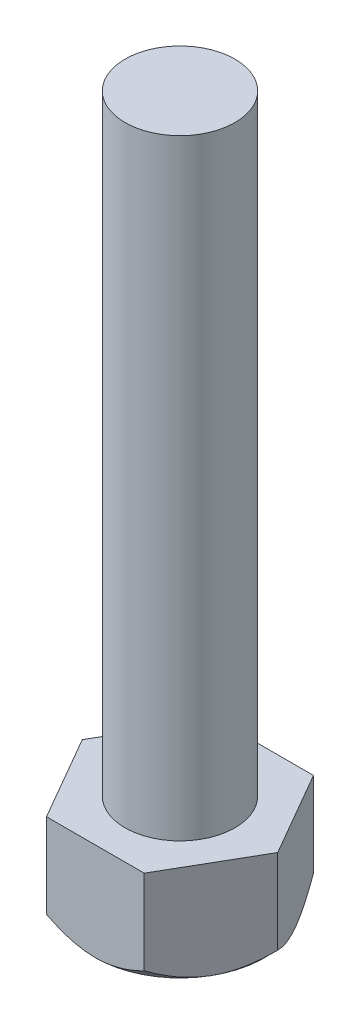
ISO-10303-21;
HEADER;
FILE_DESCRIPTION(('STEP AP214'),'2;1');
FILE_NAME('part.step','',(''),(''),'','','');
FILE_SCHEMA(('AUTOMOTIVE_DESIGN { 1 0 10303 214 1 1 1 1 }'));
ENDSEC;
DATA;
#1=APPLICATION_CONTEXT('core data for automotive mechanical design processes');
#2=APPLICATION_PROTOCOL_DEFINITION('international standard','automotive_design',2000,#1);
#3=PRODUCT_CONTEXT('',#1,'mechanical');
#4=PRODUCT('Part','Part','',(#3));
#5=PRODUCT_RELATED_PRODUCT_CATEGORY('part','',(#4));
#6=PRODUCT_DEFINITION_FORMATION('','',#4);
#7=PRODUCT_DEFINITION_CONTEXT('part definition',#1,'design');
#8=PRODUCT_DEFINITION('design','',#6,#7);
#9=PRODUCT_DEFINITION_SHAPE('','',#8);
#10=(LENGTH_UNIT() NAMED_UNIT(*) SI_UNIT(.MILLI.,.METRE.));
#11=(NAMED_UNIT(*) PLANE_ANGLE_UNIT() SI_UNIT($,.RADIAN.));
#12=(NAMED_UNIT(*) SI_UNIT($,.STERADIAN.) SOLID_ANGLE_UNIT());
#13=UNCERTAINTY_MEASURE_WITH_UNIT(LENGTH_MEASURE(1.E-05),#10,'distance_accuracy_value','');
#14=(GEOMETRIC_REPRESENTATION_CONTEXT(3) GLOBAL_UNCERTAINTY_ASSIGNED_CONTEXT((#13)) GLOBAL_UNIT_ASSIGNED_CONTEXT((#10,
#11,#12)) REPRESENTATION_CONTEXT('',''));
#15=CARTESIAN_POINT('',(0.,0.,0.));
#16=DIRECTION('',(0.,0.,1.));
#17=DIRECTION('',(1.,0.,0.));
#18=AXIS2_PLACEMENT_3D('',#15,#16,#17);
#19=CARTESIAN_POINT('',(-4.,4.,0.));
#20=DIRECTION('',(0.866025403784438,0.,-0.500000000000001));
#21=DIRECTION('',(-0.500000000000001,0.,-0.866025403784438));
#22=AXIS2_PLACEMENT_3D('',#19,#20,#21);
#23=PLANE('',#22);
#24=CARTESIAN_POINT('',(-1.99988452994616,0.536013859915936,3.46430161513775));
#25=CARTESIAN_POINT('',(-2.06863246295731,0.467325995781164,3.34522670224709));
#26=CARTESIAN_POINT('',(-2.13852994001664,0.40267241309835,3.22416072065947));
#27=CARTESIAN_POINT('',(-2.28105847687455,0.284293493314549,2.97729405329311));
#28=CARTESIAN_POINT('',(-2.35370308985488,0.230634017494356,2.851469892715));
#29=CARTESIAN_POINT('',(-2.50018745024056,0.138714421148478,2.59775153801277));
#30=CARTESIAN_POINT('',(-2.57398989649517,0.100223277486006,2.46992195137692));
#31=CARTESIAN_POINT('',(-2.72321949203156,0.0409198553913848,2.21144870991494));
#32=CARTESIAN_POINT('',(-2.79864208312694,0.020063312167609,2.08081295009925));
#33=CARTESIAN_POINT('',(-2.92863047900332,0.00124511322360298,1.85566644404699));
#34=CARTESIAN_POINT('',(-2.98302842594063,-0.001540448345799,1.76144643612413));
#35=CARTESIAN_POINT('',(-3.09173582960688,0.00315386675905833,1.57315968981528));
#36=CARTESIAN_POINT('',(-3.14604524863371,0.0106373420952294,1.47909301673127));
#37=CARTESIAN_POINT('',(-3.25414955803445,0.0354424365015808,1.29185086033204));
#38=CARTESIAN_POINT('',(-3.30794380435859,0.0527750595319466,1.19867649254375));
#39=CARTESIAN_POINT('',(-3.41460839868816,0.0963324102583245,1.01392799579621));
#40=CARTESIAN_POINT('',(-3.46747881720154,0.12255645620271,0.92235374471361));
#41=CARTESIAN_POINT('',(-3.56133806063717,0.176510647689823,0.759784766323124));
#42=CARTESIAN_POINT('',(-3.60253465928436,0.202822391913825,0.688430164367165));
#43=CARTESIAN_POINT('',(-3.68418827514934,0.259686362438078,0.547001953067301));
#44=CARTESIAN_POINT('',(-3.72464526979475,0.290238717916199,0.476928382819915));
#45=CARTESIAN_POINT('',(-3.80469221784007,0.354898965620273,0.338283001814589));
#46=CARTESIAN_POINT('',(-3.84428444795005,0.388995677398264,0.269707247679152));
#47=CARTESIAN_POINT('',(-3.92273567790658,0.460296863693675,0.133825731478174));
#48=CARTESIAN_POINT('',(-3.96159510997834,0.497499431227526,0.0665192207766153));
#49=CARTESIAN_POINT('',(-4.00011547005384,0.536013859915937,-0.000199999999999689));
#50=B_SPLINE_CURVE_WITH_KNOTS('',3,(#24,#25,#26,#27,#28,#29,#30,#31,#32,#33,#34,#35,#36,#37,#38,
#39,#40,#41,#42,#43,#44,#45,#46,#47,#48,#49),.UNSPECIFIED.,.F.,.F.,(4,2,2,2,2,2,2,2,2,2,2,2,4),
(0.,0.46141397689546,0.925516105496516,1.38224785443131,1.83782972377834,2.16386281017194,
2.49001018016783,2.81652265677474,3.14301010363181,3.40236585633197,3.66172951128433,
3.92029851377053,4.17870990731808),.UNSPECIFIED.);
#51=CARTESIAN_POINT('',(-2.,0.535898384862242,3.46410161513775));
#52=VERTEX_POINT('',#51);
#53=CARTESIAN_POINT('',(-3.,0.,1.73205080756888));
#54=VERTEX_POINT('',#53);
#55=EDGE_CURVE('E128',#52,#54,#50,.T.);
#56=ORIENTED_EDGE('',*,*,#55,.F.);
#57=DIRECTION('',(0.,-1.,0.));
#58=VECTOR('',#57,1.);
#59=CARTESIAN_POINT('',(-2.,4.,3.46410161513775));
#60=LINE('',#59,#58);
#61=CARTESIAN_POINT('',(-2.,4.,3.46410161513775));
#62=VERTEX_POINT('',#61);
#63=EDGE_CURVE('E132',#62,#52,#60,.T.);
#64=ORIENTED_EDGE('',*,*,#63,.F.);
#65=DIRECTION('',(0.500000000000001,0.,0.866025403784438));
#66=VECTOR('',#65,1.);
#67=CARTESIAN_POINT('',(-4.,4.,0.));
#68=LINE('',#67,#66);
#69=CARTESIAN_POINT('',(-4.,4.,0.));
#70=VERTEX_POINT('',#69);
#71=EDGE_CURVE('E233',#70,#62,#68,.T.);
#72=ORIENTED_EDGE('',*,*,#71,.F.);
#73=DIRECTION('',(0.,-1.,0.));
#74=VECTOR('',#73,1.);
#75=CARTESIAN_POINT('',(-4.,4.,0.));
#76=LINE('',#75,#74);
#77=CARTESIAN_POINT('',(-4.,0.535898384862244,0.));
#78=VERTEX_POINT('',#77);
#79=EDGE_CURVE('E221',#70,#78,#76,.T.);
#80=ORIENTED_EDGE('',*,*,#79,.T.);
#81=EDGE_CURVE('E187',#54,#78,#50,.T.);
#82=ORIENTED_EDGE('',*,*,#81,.F.);
#83=EDGE_LOOP('',(#56,#64,#72,#80,#82));
#84=FACE_BOUND('',#83,.T.);
#85=ADVANCED_FACE('F38',(#84),#23,.F.);
#86=CARTESIAN_POINT('',(-2.,4.,3.46410161513775));
#87=DIRECTION('',(0.,0.,-1.));
#88=DIRECTION('',(-1.,0.,0.));
#89=AXIS2_PLACEMENT_3D('',#86,#87,#88);
#90=PLANE('',#89);
#91=CARTESIAN_POINT('',(6.12330562561766,3.57115756876732,3.46410161513775));
#92=CARTESIAN_POINT('',(5.9426617997815,3.41399020044523,3.46410161513775));
#93=CARTESIAN_POINT('',(5.76123137966631,3.25770955980369,3.46410161513775));
#94=CARTESIAN_POINT('',(5.39618419077211,2.94755293704087,3.46410161513775));
#95=CARTESIAN_POINT('',(5.21256644609498,2.7936781049514,3.46410161513775));
#96=CARTESIAN_POINT('',(4.83863699097268,2.4857673575733,3.46410161513775));
#97=CARTESIAN_POINT('',(4.64826682950476,2.3318021114302,3.46410161513775));
#98=CARTESIAN_POINT('',(4.26400226748118,2.02841972308538,3.46410161513775));
#99=CARTESIAN_POINT('',(4.07010875527937,1.87900145916858,3.46410161513775));
#100=CARTESIAN_POINT('',(3.6773735453801,1.58622986260935,3.46410161513775));
#101=CARTESIAN_POINT('',(3.47852607140583,1.4428841919399,3.46410161513775));
#102=CARTESIAN_POINT('',(3.17545854797373,1.23464207559921,3.46410161513775));
#103=CARTESIAN_POINT('',(3.07358834182002,1.16632735547672,3.46410161513775));
#104=CARTESIAN_POINT('',(2.86802327233887,1.03250335605779,3.46410161513775));
#105=CARTESIAN_POINT('',(2.76432852870836,0.966993893686298,3.46410161513775));
#106=CARTESIAN_POINT('',(2.55557212591568,0.83986684875357,3.46410161513775));
#107=CARTESIAN_POINT('',(2.45052526036266,0.778225081311306,3.46410161513775));
#108=CARTESIAN_POINT('',(2.23804782632973,0.659139068336162,3.46410161513775));
#109=CARTESIAN_POINT('',(2.1306169720612,0.601695329638526,3.46410161513775));
#110=CARTESIAN_POINT('',(1.9132583375044,0.492129082614428,3.46410161513775));
#111=CARTESIAN_POINT('',(1.80333457855957,0.439998659202886,3.46410161513775));
#112=CARTESIAN_POINT('',(1.58063205734083,0.342260495490114,3.46410161513775));
#113=CARTESIAN_POINT('',(1.46785407585032,0.296650993588385,3.46410161513775));
#114=CARTESIAN_POINT('',(1.23675001483471,0.212543030042841,3.46410161513775));
#115=CARTESIAN_POINT('',(1.11835617123291,0.174228161645824,3.46410161513775));
#116=CARTESIAN_POINT('',(0.878699038057535,0.107854975582135,3.46410161513775));
#117=CARTESIAN_POINT('',(0.757436207828092,0.0797950277080224,3.46410161513775));
#118=CARTESIAN_POINT('',(0.513513895977743,0.0358155721553112,3.46410161513775));
#119=CARTESIAN_POINT('',(0.39086897356948,0.0198169279633217,3.46410161513775));
#120=CARTESIAN_POINT('',(0.144568282916073,0.000842558181825476,3.46410161513775));
#121=CARTESIAN_POINT('',(0.0209126443799982,-0.00213481298236062,3.46410161513775));
#122=CARTESIAN_POINT('',(-0.226270833074271,0.00517763883403837,3.46410161513775));
#123=CARTESIAN_POINT('',(-0.349797783224328,0.0154968437834157,3.46410161513775));
#124=CARTESIAN_POINT('',(-0.595149165300502,0.0486475093076494,3.46410161513775));
#125=CARTESIAN_POINT('',(-0.71697324001165,0.0714815559158489,3.46410161513775));
#126=CARTESIAN_POINT('',(-0.958890866974615,0.12832471634713,3.46410161513775));
#127=CARTESIAN_POINT('',(-1.0789648999152,0.162415405130286,3.46410161513775));
#128=CARTESIAN_POINT('',(-1.31603785676646,0.239868265131488,3.46410161513775));
#129=CARTESIAN_POINT('',(-1.4330367001755,0.283230678791782,3.46410161513775));
#130=CARTESIAN_POINT('',(-1.6872922274193,0.386986466744351,3.46410161513775));
#131=CARTESIAN_POINT('',(-1.82386091893597,0.449050623806043,3.46410161513775));
#132=CARTESIAN_POINT('',(-2.09294885830601,0.58147712649516,3.46410161513775));
#133=CARTESIAN_POINT('',(-2.22546574729758,0.651844194265927,3.46410161513775));
#134=CARTESIAN_POINT('',(-2.48718748012284,0.799039662294178,3.46410161513775));
#135=CARTESIAN_POINT('',(-2.61638501421286,0.875880953537441,3.46410161513776));
#136=CARTESIAN_POINT('',(-2.8717086097767,1.03442087198194,3.46410161513776));
#137=CARTESIAN_POINT('',(-2.99783526490351,1.11611854968165,3.46410161513776));
#138=CARTESIAN_POINT('',(-3.24821348879723,1.28376080862406,3.46410161513776));
#139=CARTESIAN_POINT('',(-3.37245118590576,1.36972601177335,3.46410161513776));
#140=CARTESIAN_POINT('',(-3.61877413372762,1.54469395871281,3.46410161513776));
#141=CARTESIAN_POINT('',(-3.74085922087204,1.63369693183625,3.46410161513776));
#142=CARTESIAN_POINT('',(-4.10412985090608,1.90410163377095,3.46410161513776));
#143=CARTESIAN_POINT('',(-4.34263110550769,2.08910469121418,3.46410161513776));
#144=CARTESIAN_POINT('',(-4.8427234808062,2.48792865822459,3.46410161513776));
#145=CARTESIAN_POINT('',(-5.10366879659832,2.70255178060159,3.46410161513776));
#146=CARTESIAN_POINT('',(-5.49019500293962,3.02723800850587,3.46410161513776));
#147=CARTESIAN_POINT('',(-5.61748460190559,3.13527973152068,3.46410161513776));
#148=CARTESIAN_POINT('',(-5.87108384173981,3.35244804868488,3.46410161513776));
#149=CARTESIAN_POINT('',(-5.99739370485389,3.46157438317508,3.46410161513776));
#150=CARTESIAN_POINT('',(-6.12330562561766,3.57115756876732,3.46410161513776));
#151=B_SPLINE_CURVE_WITH_KNOTS('',3,(#91,#92,#93,#94,#95,#96,#97,#98,#99,#100,#101,#102,#103,
#104,#105,#106,#107,#108,#109,#110,#111,#112,#113,#114,#115,#116,#117,#118,#119,#120,#121,#122,
#123,#124,#125,#126,#127,#128,#129,#130,#131,#132,#133,#134,#135,#136,#137,#138,#139,#140,#141,
#142,#143,#144,#145,#146,#147,#148,#149,#150),.UNSPECIFIED.,.F.,.F.,(4,2,2,2,2,2,2,2,2,2,2,2,2,
2,2,2,2,2,2,2,2,2,2,2,2,2,2,2,2,4),(0.,0.718348010521054,1.43702951022251,2.17149343947353,
2.90577468707162,3.64095636673365,4.00888831418214,4.37679621316671,4.74210997566971,
5.10746777051841,5.47227309402859,5.83697967989172,6.20991225867724,6.58278552718511,
6.95319048523883,7.32354863169162,7.69472657835838,8.06598125317446,8.43998766122979,
8.81400385021009,9.26365507843157,9.71356328230224,10.1643894961722,10.6151278543581,
11.0683097070005,11.5215258481395,12.4268672114345,13.4403751424198,13.9412505421146,
14.4420087883924),.UNSPECIFIED.);
#152=CARTESIAN_POINT('',(2.,0.535898384862243,3.46410161513775));
#153=VERTEX_POINT('',#152);
#154=CARTESIAN_POINT('',(0.,0.,3.46410161513775));
#155=VERTEX_POINT('',#154);
#156=EDGE_CURVE('E109',#153,#155,#151,.T.);
#157=ORIENTED_EDGE('',*,*,#156,.F.);
#158=DIRECTION('',(0.,-1.,0.));
#159=VECTOR('',#158,1.);
#160=CARTESIAN_POINT('',(2.,4.,3.46410161513775));
#161=LINE('',#160,#159);
#162=CARTESIAN_POINT('',(2.,4.,3.46410161513775));
#163=VERTEX_POINT('',#162);
#164=EDGE_CURVE('E218',#163,#153,#161,.T.);
#165=ORIENTED_EDGE('',*,*,#164,.F.);
#166=DIRECTION('',(1.,0.,0.));
#167=VECTOR('',#166,1.);
#168=CARTESIAN_POINT('',(-2.,4.,3.46410161513775));
#169=LINE('',#168,#167);
#170=EDGE_CURVE('E230',#62,#163,#169,.T.);
#171=ORIENTED_EDGE('',*,*,#170,.F.);
#172=ORIENTED_EDGE('',*,*,#63,.T.);
#173=EDGE_CURVE('E121',#155,#52,#151,.T.);
#174=ORIENTED_EDGE('',*,*,#173,.F.);
#175=EDGE_LOOP('',(#157,#165,#171,#172,#174));
#176=FACE_BOUND('',#175,.T.);
#177=ADVANCED_FACE('F136',(#176),#90,.F.);
#178=CARTESIAN_POINT('',(2.,4.,3.46410161513775));
#179=DIRECTION('',(-0.866025403784439,0.,-0.5));
#180=DIRECTION('',(-0.5,0.,0.866025403784439));
#181=AXIS2_PLACEMENT_3D('',#178,#179,#180);
#182=PLANE('',#181);
#183=CARTESIAN_POINT('',(4.00011547005384,0.536013859915938,-0.000199999999999576));
#184=CARTESIAN_POINT('',(3.93136753704268,0.467325995781166,0.118874912890663));
#185=CARTESIAN_POINT('',(3.86147005998336,0.402672413098352,0.239940894478286));
#186=CARTESIAN_POINT('',(3.71894152312545,0.28429349331455,0.486807561844643));
#187=CARTESIAN_POINT('',(3.64629691014512,0.230634017494358,0.612631722422753));
#188=CARTESIAN_POINT('',(3.49981254975944,0.138714421148479,0.866350077124988));
#189=CARTESIAN_POINT('',(3.42601010350483,0.100223277486008,0.994179663760835));
#190=CARTESIAN_POINT('',(3.27678050796844,0.0409198553913868,1.25265290522282));
#191=CARTESIAN_POINT('',(3.20135791687306,0.0200633121676109,1.38328866503851));
#192=CARTESIAN_POINT('',(3.07136952099668,0.00124511322360464,1.60843517109077));
#193=CARTESIAN_POINT('',(3.01697157405937,-0.00154044834579735,1.70265517901363));
#194=CARTESIAN_POINT('',(2.90826417039312,0.00315386675905971,1.89094192532248));
#195=CARTESIAN_POINT('',(2.85395475136629,0.0106373420952305,1.98500859840649));
#196=CARTESIAN_POINT('',(2.74585044196555,0.0354424365015819,2.17225075480572));
#197=CARTESIAN_POINT('',(2.69205619564141,0.052775059531948,2.26542512259401));
#198=CARTESIAN_POINT('',(2.58539160131184,0.096332410258326,2.45017361934154));
#199=CARTESIAN_POINT('',(2.53252118279846,0.122556456202712,2.54174787042415));
#200=CARTESIAN_POINT('',(2.43866193936283,0.176510647689824,2.70431684881463));
#201=CARTESIAN_POINT('',(2.39746534071564,0.202822391913826,2.77567145077059));
#202=CARTESIAN_POINT('',(2.31581172485066,0.259686362438079,2.91709966207045));
#203=CARTESIAN_POINT('',(2.27535473020525,0.290238717916199,2.98717323231784));
#204=CARTESIAN_POINT('',(2.19530778215993,0.354898965620273,3.12581861332316));
#205=CARTESIAN_POINT('',(2.15571555204995,0.388995677398264,3.1943943674586));
#206=CARTESIAN_POINT('',(2.07726432209342,0.460296863693675,3.33027588365958));
#207=CARTESIAN_POINT('',(2.03840489002166,0.497499431227526,3.39758239436114));
#208=CARTESIAN_POINT('',(1.99988452994616,0.536013859915936,3.46430161513775));
#209=B_SPLINE_CURVE_WITH_KNOTS('',3,(#183,#184,#185,#186,#187,#188,#189,#190,#191,#192,#193,
#194,#195,#196,#197,#198,#199,#200,#201,#202,#203,#204,#205,#206,#207,#208),.UNSPECIFIED.,.F.,
.F.,(4,2,2,2,2,2,2,2,2,2,2,2,4),(0.,0.46141397689546,0.925516105496516,1.38224785443131,
1.83782972377834,2.16386281017194,2.49001018016783,2.81652265677474,3.14301010363181,
3.40236585633197,3.66172951128433,3.92029851377053,4.17870990731807),.UNSPECIFIED.);
#210=CARTESIAN_POINT('',(4.,0.535898384862244,0.));
#211=VERTEX_POINT('',#210);
#212=CARTESIAN_POINT('',(3.,0.,1.73205080756888));
#213=VERTEX_POINT('',#212);
#214=EDGE_CURVE('E54',#211,#213,#209,.T.);
#215=ORIENTED_EDGE('',*,*,#214,.F.);
#216=DIRECTION('',(0.,-1.,0.));
#217=VECTOR('',#216,1.);
#218=CARTESIAN_POINT('',(4.,4.,0.));
#219=LINE('',#218,#217);
#220=CARTESIAN_POINT('',(4.,4.,0.));
#221=VERTEX_POINT('',#220);
#222=EDGE_CURVE('E215',#221,#211,#219,.T.);
#223=ORIENTED_EDGE('',*,*,#222,.F.);
#224=DIRECTION('',(0.5,0.,-0.866025403784439));
#225=VECTOR('',#224,1.);
#226=CARTESIAN_POINT('',(2.,4.,3.46410161513775));
#227=LINE('',#226,#225);
#228=EDGE_CURVE('E229',#163,#221,#227,.T.);
#229=ORIENTED_EDGE('',*,*,#228,.F.);
#230=ORIENTED_EDGE('',*,*,#164,.T.);
#231=EDGE_CURVE('E115',#213,#153,#209,.T.);
#232=ORIENTED_EDGE('',*,*,#231,.F.);
#233=EDGE_LOOP('',(#215,#223,#229,#230,#232));
#234=FACE_BOUND('',#233,.T.);
#235=ADVANCED_FACE('F227',(#234),#182,.F.);
#236=CARTESIAN_POINT('',(4.,4.,0.));
#237=DIRECTION('',(-0.866025403784439,0.,0.5));
#238=DIRECTION('',(0.5,0.,0.866025403784438));
#239=AXIS2_PLACEMENT_3D('',#236,#237,#238);
#240=PLANE('',#239);
#241=CARTESIAN_POINT('',(1.99988452994616,0.536013859915936,-3.46430161513775));
#242=CARTESIAN_POINT('',(2.06863246295732,0.467325995781164,-3.34522670224709));
#243=CARTESIAN_POINT('',(2.13852994001664,0.40267241309835,-3.22416072065947));
#244=CARTESIAN_POINT('',(2.28105847687455,0.284293493314549,-2.97729405329311));
#245=CARTESIAN_POINT('',(2.35370308985488,0.230634017494357,-2.851469892715));
#246=CARTESIAN_POINT('',(2.50018745024056,0.138714421148478,-2.59775153801277));
#247=CARTESIAN_POINT('',(2.57398989649517,0.100223277486007,-2.46992195137692));
#248=CARTESIAN_POINT('',(2.72321949203156,0.0409198553913856,-2.21144870991494));
#249=CARTESIAN_POINT('',(2.79864208312694,0.0200633121676099,-2.08081295009925));
#250=CARTESIAN_POINT('',(2.92863047900332,0.00124511322360396,-1.85566644404699));
#251=CARTESIAN_POINT('',(2.98302842594063,-0.00154044834579799,-1.76144643612413));
#252=CARTESIAN_POINT('',(3.09173582960688,0.00315386675905906,-1.57315968981528));
#253=CARTESIAN_POINT('',(3.14604524863371,0.0106373420952298,-1.47909301673127));
#254=CARTESIAN_POINT('',(3.25414955803445,0.0354424365015808,-1.29185086033204));
#255=CARTESIAN_POINT('',(3.30794380435859,0.0527750595319466,-1.19867649254375));
#256=CARTESIAN_POINT('',(3.41460839868816,0.0963324102583245,-1.01392799579621));
#257=CARTESIAN_POINT('',(3.46747881720154,0.122556456202711,-0.92235374471361));
#258=CARTESIAN_POINT('',(3.56133806063717,0.176510647689823,-0.759784766323125));
#259=CARTESIAN_POINT('',(3.60253465928436,0.202822391913825,-0.688430164367165));
#260=CARTESIAN_POINT('',(3.68418827514934,0.259686362438078,-0.547001953067301));
#261=CARTESIAN_POINT('',(3.72464526979475,0.290238717916199,-0.476928382819915));
#262=CARTESIAN_POINT('',(3.80469221784007,0.354898965620273,-0.338283001814589));
#263=CARTESIAN_POINT('',(3.84428444795005,0.388995677398265,-0.269707247679152));
#264=CARTESIAN_POINT('',(3.92273567790658,0.460296863693675,-0.133825731478173));
#265=CARTESIAN_POINT('',(3.96159510997834,0.497499431227527,-0.0665192207766143));
#266=CARTESIAN_POINT('',(4.00011547005384,0.536013859915938,0.000200000000000841));
#267=B_SPLINE_CURVE_WITH_KNOTS('',3,(#241,#242,#243,#244,#245,#246,#247,#248,#249,#250,#251,
#252,#253,#254,#255,#256,#257,#258,#259,#260,#261,#262,#263,#264,#265,#266),.UNSPECIFIED.,.F.,
.F.,(4,2,2,2,2,2,2,2,2,2,2,2,4),(0.,0.46141397689546,0.925516105496515,1.38224785443131,
1.83782972377834,2.16386281017193,2.49001018016782,2.81652265677473,3.14301010363181,
3.40236585633197,3.66172951128433,3.92029851377053,4.17870990731808),.UNSPECIFIED.);
#268=CARTESIAN_POINT('',(2.,0.535898384862243,-3.46410161513775));
#269=VERTEX_POINT('',#268);
#270=CARTESIAN_POINT('',(3.,0.,-1.73205080756888));
#271=VERTEX_POINT('',#270);
#272=EDGE_CURVE('E61',#269,#271,#267,.T.);
#273=ORIENTED_EDGE('',*,*,#272,.F.);
#274=DIRECTION('',(0.,-1.,0.));
#275=VECTOR('',#274,1.);
#276=CARTESIAN_POINT('',(2.,4.,-3.46410161513775));
#277=LINE('',#276,#275);
#278=CARTESIAN_POINT('',(2.,4.,-3.46410161513775));
#279=VERTEX_POINT('',#278);
#280=EDGE_CURVE('E209',#279,#269,#277,.T.);
#281=ORIENTED_EDGE('',*,*,#280,.F.);
#282=DIRECTION('',(-0.5,0.,-0.866025403784438));
#283=VECTOR('',#282,1.);
#284=CARTESIAN_POINT('',(4.,4.,0.));
#285=LINE('',#284,#283);
#286=EDGE_CURVE('E248',#221,#279,#285,.T.);
#287=ORIENTED_EDGE('',*,*,#286,.F.);
#288=ORIENTED_EDGE('',*,*,#222,.T.);
#289=EDGE_CURVE('E120',#271,#211,#267,.T.);
#290=ORIENTED_EDGE('',*,*,#289,.F.);
#291=EDGE_LOOP('',(#273,#281,#287,#288,#290));
#292=FACE_BOUND('',#291,.T.);
#293=ADVANCED_FACE('F207',(#292),#240,.F.);
#294=CARTESIAN_POINT('',(2.,4.,-3.46410161513775));
#295=DIRECTION('',(0.,0.,1.));
#296=DIRECTION('',(1.,0.,0.));
#297=AXIS2_PLACEMENT_3D('',#294,#295,#296);
#298=PLANE('',#297);
#299=CARTESIAN_POINT('',(-6.12330562561766,3.57115756876732,-3.46410161513775));
#300=CARTESIAN_POINT('',(-5.9426617997815,3.41399020044523,-3.46410161513775));
#301=CARTESIAN_POINT('',(-5.76123137966631,3.25770955980369,-3.46410161513775));
#302=CARTESIAN_POINT('',(-5.39618419077211,2.94755293704087,-3.46410161513775));
#303=CARTESIAN_POINT('',(-5.21256644609498,2.7936781049514,-3.46410161513775));
#304=CARTESIAN_POINT('',(-4.83863699097268,2.4857673575733,-3.46410161513775));
#305=CARTESIAN_POINT('',(-4.64826682950476,2.3318021114302,-3.46410161513775));
#306=CARTESIAN_POINT('',(-4.26400226748118,2.02841972308538,-3.46410161513775));
#307=CARTESIAN_POINT('',(-4.07010875527937,1.87900145916858,-3.46410161513775));
#308=CARTESIAN_POINT('',(-3.6773735453801,1.58622986260935,-3.46410161513775));
#309=CARTESIAN_POINT('',(-3.47852607140582,1.4428841919399,-3.46410161513775));
#310=CARTESIAN_POINT('',(-3.17545854797373,1.23464207559921,-3.46410161513775));
#311=CARTESIAN_POINT('',(-3.07358834182002,1.16632735547672,-3.46410161513775));
#312=CARTESIAN_POINT('',(-2.86802327233887,1.0325033560578,-3.46410161513775));
#313=CARTESIAN_POINT('',(-2.76432852870836,0.966993893686298,-3.46410161513775));
#314=CARTESIAN_POINT('',(-2.55557212591568,0.83986684875357,-3.46410161513775));
#315=CARTESIAN_POINT('',(-2.45052526036266,0.778225081311307,-3.46410161513775));
#316=CARTESIAN_POINT('',(-2.23804782632972,0.659139068336163,-3.46410161513775));
#317=CARTESIAN_POINT('',(-2.1306169720612,0.601695329638526,-3.46410161513775));
#318=CARTESIAN_POINT('',(-1.9132583375044,0.492129082614428,-3.46410161513775));
#319=CARTESIAN_POINT('',(-1.80333457855956,0.439998659202886,-3.46410161513775));
#320=CARTESIAN_POINT('',(-1.58063205734083,0.342260495490115,-3.46410161513775));
#321=CARTESIAN_POINT('',(-1.46785407585032,0.296650993588385,-3.46410161513775));
#322=CARTESIAN_POINT('',(-1.23675001483471,0.212543030042841,-3.46410161513775));
#323=CARTESIAN_POINT('',(-1.11835617123291,0.174228161645824,-3.46410161513775));
#324=CARTESIAN_POINT('',(-0.878699038057533,0.107854975582134,-3.46410161513775));
#325=CARTESIAN_POINT('',(-0.757436207828089,0.0797950277080226,-3.46410161513775));
#326=CARTESIAN_POINT('',(-0.513513895977741,0.0358155721553116,-3.46410161513775));
#327=CARTESIAN_POINT('',(-0.390868973569478,0.0198169279633219,-3.46410161513775));
#328=CARTESIAN_POINT('',(-0.144568282916071,0.000842558181825484,-3.46410161513775));
#329=CARTESIAN_POINT('',(-0.0209126443799965,-0.0021348129823606,-3.46410161513775));
#330=CARTESIAN_POINT('',(0.226270833074273,0.00517763883403826,-3.46410161513775));
#331=CARTESIAN_POINT('',(0.34979778322433,0.0154968437834155,-3.46410161513775));
#332=CARTESIAN_POINT('',(0.595149165300505,0.0486475093076492,-3.46410161513775));
#333=CARTESIAN_POINT('',(0.716973240011652,0.0714815559158489,-3.46410161513775));
#334=CARTESIAN_POINT('',(0.958890866974617,0.128324716347131,-3.46410161513775));
#335=CARTESIAN_POINT('',(1.0789648999152,0.162415405130286,-3.46410161513775));
#336=CARTESIAN_POINT('',(1.31603785676646,0.239868265131488,-3.46410161513775));
#337=CARTESIAN_POINT('',(1.43303670017551,0.283230678791782,-3.46410161513775));
#338=CARTESIAN_POINT('',(1.6872922274193,0.38698646674435,-3.46410161513775));
#339=CARTESIAN_POINT('',(1.82386091893597,0.449050623806043,-3.46410161513775));
#340=CARTESIAN_POINT('',(2.09294885830602,0.581477126495159,-3.46410161513775));
#341=CARTESIAN_POINT('',(2.22546574729758,0.651844194265927,-3.46410161513775));
#342=CARTESIAN_POINT('',(2.48718748012284,0.799039662294178,-3.46410161513775));
#343=CARTESIAN_POINT('',(2.61638501421286,0.875880953537441,-3.46410161513775));
#344=CARTESIAN_POINT('',(2.8717086097767,1.03442087198194,-3.46410161513775));
#345=CARTESIAN_POINT('',(2.99783526490351,1.11611854968165,-3.46410161513775));
#346=CARTESIAN_POINT('',(3.24821348879723,1.28376080862406,-3.46410161513775));
#347=CARTESIAN_POINT('',(3.37245118590576,1.36972601177335,-3.46410161513775));
#348=CARTESIAN_POINT('',(3.61877413372762,1.54469395871281,-3.46410161513775));
#349=CARTESIAN_POINT('',(3.74085922087204,1.63369693183626,-3.46410161513775));
#350=CARTESIAN_POINT('',(4.10412985090609,1.90410163377095,-3.46410161513775));
#351=CARTESIAN_POINT('',(4.34263110550769,2.08910469121418,-3.46410161513775));
#352=CARTESIAN_POINT('',(4.8427234808062,2.48792865822459,-3.46410161513775));
#353=CARTESIAN_POINT('',(5.10366879659832,2.70255178060159,-3.46410161513775));
#354=CARTESIAN_POINT('',(5.49019500293962,3.02723800850587,-3.46410161513775));
#355=CARTESIAN_POINT('',(5.61748460190559,3.13527973152068,-3.46410161513775));
#356=CARTESIAN_POINT('',(5.87108384173982,3.35244804868488,-3.46410161513775));
#357=CARTESIAN_POINT('',(5.99739370485389,3.46157438317508,-3.46410161513775));
#358=CARTESIAN_POINT('',(6.12330562561766,3.57115756876732,-3.46410161513775));
#359=B_SPLINE_CURVE_WITH_KNOTS('',3,(#299,#300,#301,#302,#303,#304,#305,#306,#307,#308,#309,
#310,#311,#312,#313,#314,#315,#316,#317,#318,#319,#320,#321,#322,#323,#324,#325,#326,#327,#328,
#329,#330,#331,#332,#333,#334,#335,#336,#337,#338,#339,#340,#341,#342,#343,#344,#345,#346,#347,
#348,#349,#350,#351,#352,#353,#354,#355,#356,#357,#358),.UNSPECIFIED.,.F.,.F.,(4,2,2,2,2,2,2,2,
2,2,2,2,2,2,2,2,2,2,2,2,2,2,2,2,2,2,2,2,2,4),(0.,0.718348010521052,1.43702951022251,
2.17149343947353,2.90577468707162,3.64095636673364,4.00888831418214,4.37679621316671,
4.74210997566971,5.10746777051841,5.47227309402859,5.83697967989172,6.20991225867724,
6.58278552718511,6.95319048523883,7.32354863169162,7.69472657835838,8.06598125317446,
8.43998766122979,8.81400385021009,9.26365507843156,9.71356328230224,10.1643894961722,
10.6151278543581,11.0683097070005,11.5215258481395,12.4268672114345,13.4403751424198,
13.9412505421146,14.4420087883924),.UNSPECIFIED.);
#360=CARTESIAN_POINT('',(-2.,0.535898384862243,-3.46410161513775));
#361=VERTEX_POINT('',#360);
#362=CARTESIAN_POINT('',(0.,0.,-3.46410161513775));
#363=VERTEX_POINT('',#362);
#364=EDGE_CURVE('E180',#361,#363,#359,.T.);
#365=ORIENTED_EDGE('',*,*,#364,.F.);
#366=DIRECTION('',(0.,-1.,0.));
#367=VECTOR('',#366,1.);
#368=CARTESIAN_POINT('',(-2.,4.,-3.46410161513775));
#369=LINE('',#368,#367);
#370=CARTESIAN_POINT('',(-2.,4.,-3.46410161513775));
#371=VERTEX_POINT('',#370);
#372=EDGE_CURVE('E216',#371,#361,#369,.T.);
#373=ORIENTED_EDGE('',*,*,#372,.F.);
#374=DIRECTION('',(-1.,0.,0.));
#375=VECTOR('',#374,1.);
#376=CARTESIAN_POINT('',(2.,4.,-3.46410161513775));
#377=LINE('',#376,#375);
#378=EDGE_CURVE('E214',#279,#371,#377,.T.);
#379=ORIENTED_EDGE('',*,*,#378,.F.);
#380=ORIENTED_EDGE('',*,*,#280,.T.);
#381=EDGE_CURVE('E138',#363,#269,#359,.T.);
#382=ORIENTED_EDGE('',*,*,#381,.F.);
#383=EDGE_LOOP('',(#365,#373,#379,#380,#382));
#384=FACE_BOUND('',#383,.T.);
#385=ADVANCED_FACE('F212',(#384),#298,.F.);
#386=CARTESIAN_POINT('',(-2.,4.,-3.46410161513775));
#387=DIRECTION('',(0.866025403784439,0.,0.5));
#388=DIRECTION('',(0.5,0.,-0.866025403784439));
#389=AXIS2_PLACEMENT_3D('',#386,#387,#388);
#390=PLANE('',#389);
#391=CARTESIAN_POINT('',(-4.00011547005384,0.536013859915937,0.000200000000000611));
#392=CARTESIAN_POINT('',(-3.93136753704268,0.467325995781164,-0.118874912890662));
#393=CARTESIAN_POINT('',(-3.86147005998336,0.40267241309835,-0.239940894478286));
#394=CARTESIAN_POINT('',(-3.71894152312545,0.284293493314549,-0.486807561844642));
#395=CARTESIAN_POINT('',(-3.64629691014512,0.230634017494357,-0.612631722422753));
#396=CARTESIAN_POINT('',(-3.49981254975943,0.138714421148478,-0.866350077124987));
#397=CARTESIAN_POINT('',(-3.42601010350483,0.100223277486007,-0.994179663760835));
#398=CARTESIAN_POINT('',(-3.27678050796844,0.0409198553913857,-1.25265290522282));
#399=CARTESIAN_POINT('',(-3.20135791687306,0.0200633121676099,-1.38328866503851));
#400=CARTESIAN_POINT('',(-3.07136952099668,0.00124511322360344,-1.60843517109077));
#401=CARTESIAN_POINT('',(-3.01697157405937,-0.00154044834579881,-1.70265517901363));
#402=CARTESIAN_POINT('',(-2.90826417039312,0.00315386675905835,-1.89094192532248));
#403=CARTESIAN_POINT('',(-2.85395475136629,0.0106373420952295,-1.98500859840649));
#404=CARTESIAN_POINT('',(-2.74585044196555,0.0354424365015807,-2.17225075480571));
#405=CARTESIAN_POINT('',(-2.69205619564141,0.0527750595319464,-2.26542512259401));
#406=CARTESIAN_POINT('',(-2.58539160131184,0.096332410258324,-2.45017361934154));
#407=CARTESIAN_POINT('',(-2.53252118279846,0.12255645620271,-2.54174787042414));
#408=CARTESIAN_POINT('',(-2.43866193936283,0.176510647689822,-2.70431684881463));
#409=CARTESIAN_POINT('',(-2.39746534071564,0.202822391913824,-2.77567145077059));
#410=CARTESIAN_POINT('',(-2.31581172485066,0.259686362438077,-2.91709966207045));
#411=CARTESIAN_POINT('',(-2.27535473020525,0.290238717916198,-2.98717323231784));
#412=CARTESIAN_POINT('',(-2.19530778215993,0.354898965620272,-3.12581861332317));
#413=CARTESIAN_POINT('',(-2.15571555204995,0.388995677398264,-3.1943943674586));
#414=CARTESIAN_POINT('',(-2.07726432209342,0.460296863693674,-3.33027588365958));
#415=CARTESIAN_POINT('',(-2.03840489002166,0.497499431227526,-3.39758239436114));
#416=CARTESIAN_POINT('',(-1.99988452994616,0.536013859915937,-3.46430161513775));
#417=B_SPLINE_CURVE_WITH_KNOTS('',3,(#391,#392,#393,#394,#395,#396,#397,#398,#399,#400,#401,
#402,#403,#404,#405,#406,#407,#408,#409,#410,#411,#412,#413,#414,#415,#416),.UNSPECIFIED.,.F.,
.F.,(4,2,2,2,2,2,2,2,2,2,2,2,4),(0.,0.461413976895461,0.925516105496517,1.38224785443131,
1.83782972377834,2.16386281017194,2.49001018016783,2.81652265677474,3.14301010363181,
3.40236585633197,3.66172951128433,3.92029851377053,4.17870990731808),.UNSPECIFIED.);
#418=CARTESIAN_POINT('',(-3.,0.,-1.73205080756888));
#419=VERTEX_POINT('',#418);
#420=EDGE_CURVE('E195',#78,#419,#417,.T.);
#421=ORIENTED_EDGE('',*,*,#420,.F.);
#422=ORIENTED_EDGE('',*,*,#79,.F.);
#423=DIRECTION('',(-0.5,0.,0.866025403784439));
#424=VECTOR('',#423,1.);
#425=CARTESIAN_POINT('',(-2.,4.,-3.46410161513775));
#426=LINE('',#425,#424);
#427=EDGE_CURVE('E238',#371,#70,#426,.T.);
#428=ORIENTED_EDGE('',*,*,#427,.F.);
#429=ORIENTED_EDGE('',*,*,#372,.T.);
#430=EDGE_CURVE('E170',#419,#361,#417,.T.);
#431=ORIENTED_EDGE('',*,*,#430,.F.);
#432=EDGE_LOOP('',(#421,#422,#428,#429,#431));
#433=FACE_BOUND('',#432,.T.);
#434=ADVANCED_FACE('F257',(#433),#390,.F.);
#435=CARTESIAN_POINT('',(0.,4.,0.));
#436=DIRECTION('',(0.,1.,0.));
#437=DIRECTION('',(0.,0.,1.));
#438=AXIS2_PLACEMENT_3D('',#435,#436,#437);
#439=PLANE('',#438);
#440=CARTESIAN_POINT('',(0.,4.,0.));
#441=DIRECTION('',(0.,1.,0.));
#442=DIRECTION('',(0.,0.,1.));
#443=AXIS2_PLACEMENT_3D('',#440,#441,#442);
#444=CIRCLE('',#443,2.25);
#445=CARTESIAN_POINT('',(0.,4.,-2.25));
#446=VERTEX_POINT('',#445);
#447=EDGE_CURVE('E242',#446,#446,#444,.F.);
#448=ORIENTED_EDGE('',*,*,#447,.T.);
#449=EDGE_LOOP('',(#448));
#450=FACE_BOUND('',#449,.T.);
#451=ORIENTED_EDGE('',*,*,#71,.T.);
#452=ORIENTED_EDGE('',*,*,#170,.T.);
#453=ORIENTED_EDGE('',*,*,#228,.T.);
#454=ORIENTED_EDGE('',*,*,#286,.T.);
#455=ORIENTED_EDGE('',*,*,#378,.T.);
#456=ORIENTED_EDGE('',*,*,#427,.T.);
#457=EDGE_LOOP('',(#451,#452,#453,#454,#455,#456));
#458=FACE_BOUND('',#457,.T.);
#459=ADVANCED_FACE('F236',(#450,#458),#439,.T.);
#460=CARTESIAN_POINT('',(0.,29.,0.));
#461=DIRECTION('',(0.,-1.,0.));
#462=DIRECTION('',(0.,0.,-1.));
#463=AXIS2_PLACEMENT_3D('',#460,#461,#462);
#464=CYLINDRICAL_SURFACE('',#463,2.25);
#465=CARTESIAN_POINT('',(0.,29.,0.));
#466=DIRECTION('',(0.,1.,0.));
#467=DIRECTION('',(0.,0.,1.));
#468=AXIS2_PLACEMENT_3D('',#465,#466,#467);
#469=CIRCLE('',#468,2.25);
#470=CARTESIAN_POINT('',(0.,29.,-2.25));
#471=VERTEX_POINT('',#470);
#472=EDGE_CURVE('E252',#471,#471,#469,.T.);
#473=CARTESIAN_POINT('',(0.,4.,-2.25));
#474=CARTESIAN_POINT('',(0.,4.26041666666666,-2.25));
#475=CARTESIAN_POINT('',(0.,4.52083333333333,-2.25));
#476=CARTESIAN_POINT('',(0.,5.04166666666666,-2.25));
#477=CARTESIAN_POINT('',(0.,5.30208333333333,-2.25));
#478=CARTESIAN_POINT('',(0.,5.82291666666666,-2.25));
#479=CARTESIAN_POINT('',(0.,6.08333333333333,-2.25));
#480=CARTESIAN_POINT('',(0.,6.60416666666667,-2.25));
#481=CARTESIAN_POINT('',(0.,6.86458333333333,-2.25));
#482=CARTESIAN_POINT('',(0.,7.38541666666667,-2.25));
#483=CARTESIAN_POINT('',(0.,7.64583333333333,-2.25));
#484=CARTESIAN_POINT('',(0.,8.16666666666666,-2.25));
#485=CARTESIAN_POINT('',(0.,8.42708333333333,-2.25));
#486=CARTESIAN_POINT('',(0.,8.94791666666666,-2.25));
#487=CARTESIAN_POINT('',(0.,9.20833333333333,-2.25));
#488=CARTESIAN_POINT('',(0.,9.72916666666667,-2.25));
#489=CARTESIAN_POINT('',(0.,9.98958333333333,-2.25));
#490=CARTESIAN_POINT('',(0.,10.5104166666667,-2.25));
#491=CARTESIAN_POINT('',(0.,10.7708333333333,-2.25));
#492=CARTESIAN_POINT('',(0.,11.2916666666667,-2.25));
#493=CARTESIAN_POINT('',(0.,11.5520833333333,-2.25));
#494=CARTESIAN_POINT('',(0.,12.0729166666667,-2.25));
#495=CARTESIAN_POINT('',(0.,12.3333333333333,-2.25));
#496=CARTESIAN_POINT('',(0.,12.8541666666667,-2.25));
#497=CARTESIAN_POINT('',(0.,13.1145833333333,-2.25));
#498=CARTESIAN_POINT('',(0.,13.6354166666667,-2.25));
#499=CARTESIAN_POINT('',(0.,13.8958333333333,-2.25));
#500=CARTESIAN_POINT('',(0.,14.4166666666667,-2.25));
#501=CARTESIAN_POINT('',(0.,14.6770833333333,-2.25));
#502=CARTESIAN_POINT('',(0.,15.1979166666667,-2.25));
#503=CARTESIAN_POINT('',(0.,15.4583333333333,-2.25));
#504=CARTESIAN_POINT('',(0.,15.9791666666667,-2.25));
#505=CARTESIAN_POINT('',(0.,16.2395833333333,-2.25));
#506=CARTESIAN_POINT('',(0.,16.7604166666667,-2.25));
#507=CARTESIAN_POINT('',(0.,17.0208333333333,-2.25));
#508=CARTESIAN_POINT('',(0.,17.5416666666667,-2.25));
#509=CARTESIAN_POINT('',(0.,17.8020833333333,-2.25));
#510=CARTESIAN_POINT('',(0.,18.3229166666667,-2.25));
#511=CARTESIAN_POINT('',(0.,18.5833333333333,-2.25));
#512=CARTESIAN_POINT('',(0.,19.1041666666667,-2.25));
#513=CARTESIAN_POINT('',(0.,19.3645833333333,-2.25));
#514=CARTESIAN_POINT('',(0.,19.8854166666667,-2.25));
#515=CARTESIAN_POINT('',(0.,20.1458333333333,-2.25));
#516=CARTESIAN_POINT('',(0.,20.6666666666667,-2.25));
#517=CARTESIAN_POINT('',(0.,20.9270833333333,-2.25));
#518=CARTESIAN_POINT('',(0.,21.4479166666667,-2.25));
#519=CARTESIAN_POINT('',(0.,21.7083333333333,-2.25));
#520=CARTESIAN_POINT('',(0.,22.2291666666667,-2.25));
#521=CARTESIAN_POINT('',(0.,22.4895833333333,-2.25));
#522=CARTESIAN_POINT('',(0.,23.0104166666667,-2.25));
#523=CARTESIAN_POINT('',(0.,23.2708333333333,-2.25));
#524=CARTESIAN_POINT('',(0.,23.7916666666667,-2.25));
#525=CARTESIAN_POINT('',(0.,24.0520833333333,-2.25));
#526=CARTESIAN_POINT('',(0.,24.5729166666667,-2.25));
#527=CARTESIAN_POINT('',(0.,24.8333333333333,-2.25));
#528=CARTESIAN_POINT('',(0.,25.3541666666667,-2.25));
#529=CARTESIAN_POINT('',(0.,25.6145833333333,-2.25));
#530=CARTESIAN_POINT('',(0.,26.1354166666667,-2.25));
#531=CARTESIAN_POINT('',(0.,26.3958333333333,-2.25));
#532=CARTESIAN_POINT('',(0.,26.9166666666667,-2.25));
#533=CARTESIAN_POINT('',(0.,27.1770833333333,-2.25));
#534=CARTESIAN_POINT('',(0.,27.6979166666667,-2.25));
#535=CARTESIAN_POINT('',(0.,27.9583333333333,-2.25));
#536=CARTESIAN_POINT('',(0.,28.4791666666667,-2.25));
#537=CARTESIAN_POINT('',(0.,28.7395833333333,-2.25));
#538=CARTESIAN_POINT('',(0.,29.,-2.25));
#539=B_SPLINE_CURVE_WITH_KNOTS('',3,(#473,#474,#475,#476,#477,#478,#479,#480,#481,#482,#483,
#484,#485,#486,#487,#488,#489,#490,#491,#492,#493,#494,#495,#496,#497,#498,#499,#500,#501,#502,
#503,#504,#505,#506,#507,#508,#509,#510,#511,#512,#513,#514,#515,#516,#517,#518,#519,#520,#521,
#522,#523,#524,#525,#526,#527,#528,#529,#530,#531,#532,#533,#534,#535,#536,#537,#538),
.UNSPECIFIED.,.F.,.F.,(4,2,2,2,2,2,2,2,2,2,2,2,2,2,2,2,2,2,2,2,2,2,2,2,2,2,2,2,2,2,2,2,4),(0.,
0.781250000000001,1.5625,2.34375,3.125,3.90625,4.6875,5.46875,6.25,7.03125,7.8125,8.59375,9.375,
10.15625,10.9375,11.71875,12.5,13.28125,14.0625,14.84375,15.625,16.40625,17.1875,17.96875,18.75,
19.53125,20.3125,21.09375,21.875,22.65625,23.4375,24.21875,25.),.UNSPECIFIED.);
#540=EDGE_CURVE('BSEAM263',#446,#471,#539,.T.);
#541=ORIENTED_EDGE('',*,*,#447,.F.);
#542=ORIENTED_EDGE('',*,*,#472,.F.);
#543=ORIENTED_EDGE('',*,*,#540,.T.);
#544=ORIENTED_EDGE('',*,*,#540,.F.);
#545=EDGE_LOOP('',(#541,#543,#542,#544));
#546=FACE_BOUND('',#545,.T.);
#547=ADVANCED_FACE('F263',(#546),#464,.T.);
#548=CARTESIAN_POINT('',(0.,29.,0.));
#549=DIRECTION('',(0.,1.,0.));
#550=DIRECTION('',(0.,0.,1.));
#551=AXIS2_PLACEMENT_3D('',#548,#549,#550);
#552=PLANE('',#551);
#553=ORIENTED_EDGE('',*,*,#472,.T.);
#554=EDGE_LOOP('',(#553));
#555=FACE_BOUND('',#554,.T.);
#556=ADVANCED_FACE('F165',(#555),#552,.T.);
#557=CARTESIAN_POINT('',(0.,0.,0.));
#558=DIRECTION('',(0.,1.,0.));
#559=DIRECTION('',(0.,0.,-1.));
#560=AXIS2_PLACEMENT_3D('',#557,#558,#559);
#561=CONICAL_SURFACE('',#560,3.46410161513775,0.78539816339745);
#562=ORIENTED_EDGE('',*,*,#173,.T.);
#563=ORIENTED_EDGE('',*,*,#55,.T.);
#564=CARTESIAN_POINT('',(0.,0.,0.));
#565=DIRECTION('',(0.,1.,0.));
#566=DIRECTION('',(0.,0.,1.));
#567=AXIS2_PLACEMENT_3D('',#564,#565,#566);
#568=CIRCLE('',#567,3.46410161513776);
#569=EDGE_CURVE('E42',#54,#155,#568,.T.);
#570=ORIENTED_EDGE('',*,*,#569,.T.);
#571=EDGE_LOOP('',(#562,#563,#570));
#572=FACE_BOUND('',#571,.T.);
#573=ADVANCED_FACE('F126',(#572),#561,.T.);
#574=ORIENTED_EDGE('',*,*,#81,.T.);
#575=ORIENTED_EDGE('',*,*,#420,.T.);
#576=EDGE_CURVE('E131',#419,#54,#568,.T.);
#577=ORIENTED_EDGE('',*,*,#576,.T.);
#578=EDGE_LOOP('',(#574,#575,#577));
#579=FACE_BOUND('',#578,.T.);
#580=ADVANCED_FACE('F303',(#579),#561,.T.);
#581=ORIENTED_EDGE('',*,*,#364,.T.);
#582=EDGE_CURVE('E413',#363,#419,#568,.T.);
#583=ORIENTED_EDGE('',*,*,#582,.T.);
#584=ORIENTED_EDGE('',*,*,#430,.T.);
#585=EDGE_LOOP('',(#581,#583,#584));
#586=FACE_BOUND('',#585,.T.);
#587=ADVANCED_FACE('F164',(#586),#561,.T.);
#588=ORIENTED_EDGE('',*,*,#272,.T.);
#589=CARTESIAN_POINT('',(0.,0.,0.));
#590=DIRECTION('',(0.,-1.,0.));
#591=DIRECTION('',(0.,0.,-1.));
#592=AXIS2_PLACEMENT_3D('',#589,#590,#591);
#593=CIRCLE('',#592,3.46410161513775);
#594=EDGE_CURVE('E200',#363,#271,#593,.T.);
#595=ORIENTED_EDGE('',*,*,#594,.F.);
#596=ORIENTED_EDGE('',*,*,#381,.T.);
#597=EDGE_LOOP('',(#588,#595,#596));
#598=FACE_BOUND('',#597,.T.);
#599=ADVANCED_FACE('F163',(#598),#561,.T.);
#600=ORIENTED_EDGE('',*,*,#214,.T.);
#601=EDGE_CURVE('E47',#213,#271,#568,.T.);
#602=ORIENTED_EDGE('',*,*,#601,.T.);
#603=ORIENTED_EDGE('',*,*,#289,.T.);
#604=EDGE_LOOP('',(#600,#602,#603));
#605=FACE_BOUND('',#604,.T.);
#606=ADVANCED_FACE('F159',(#605),#561,.T.);
#607=ORIENTED_EDGE('',*,*,#231,.T.);
#608=ORIENTED_EDGE('',*,*,#156,.T.);
#609=EDGE_CURVE('E12',#155,#213,#568,.T.);
#610=ORIENTED_EDGE('',*,*,#609,.T.);
#611=EDGE_LOOP('',(#607,#608,#610));
#612=FACE_BOUND('',#611,.T.);
#613=ADVANCED_FACE('F111',(#612),#561,.T.);
#614=CARTESIAN_POINT('',(0.,0.,0.));
#615=DIRECTION('',(0.,1.,0.));
#616=DIRECTION('',(0.,0.,1.));
#617=AXIS2_PLACEMENT_3D('',#614,#615,#616);
#618=PLANE('',#617);
#619=ORIENTED_EDGE('',*,*,#609,.F.);
#620=ORIENTED_EDGE('',*,*,#569,.F.);
#621=ORIENTED_EDGE('',*,*,#576,.F.);
#622=ORIENTED_EDGE('',*,*,#582,.F.);
#623=ORIENTED_EDGE('',*,*,#594,.T.);
#624=ORIENTED_EDGE('',*,*,#601,.F.);
#625=EDGE_LOOP('',(#619,#620,#621,#622,#623,#624));
#626=FACE_BOUND('',#625,.T.);
#627=ADVANCED_FACE('F133',(#626),#618,.F.);
#628=CLOSED_SHELL('',(#85,#177,#235,#293,#385,#434,#459,#547,#556,#573,#580,#587,#599,#606,#613,#627));
#629=MANIFOLD_SOLID_BREP('B2',#628);
#630=ADVANCED_BREP_SHAPE_REPRESENTATION('',(#18,#629),#14);
#631=SHAPE_DEFINITION_REPRESENTATION(#9,#630);
ENDSEC;
END-ISO-10303-21;
